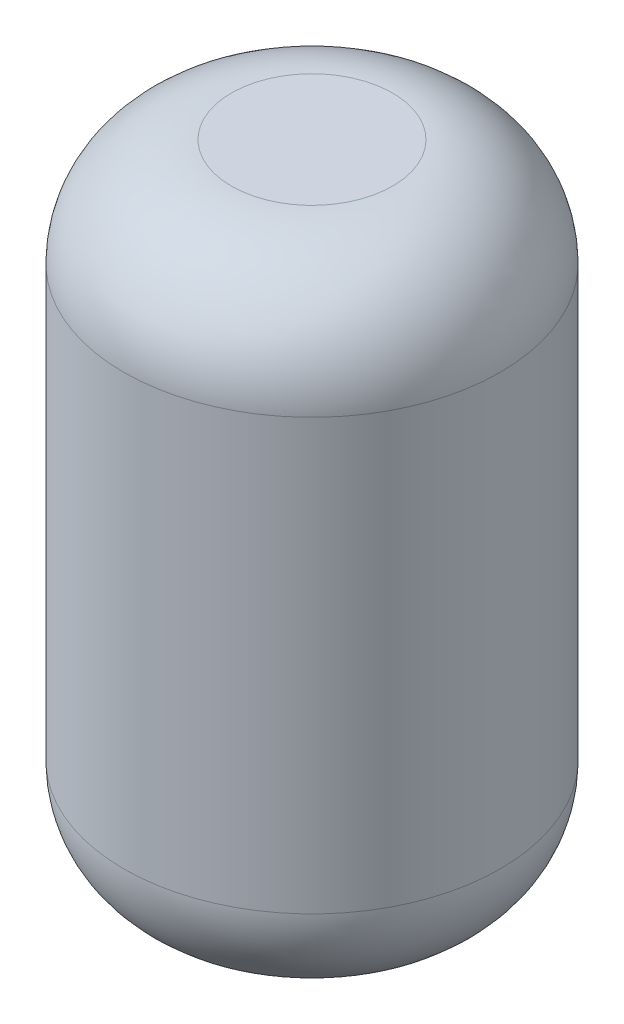
ISO-10303-21;
HEADER;
FILE_DESCRIPTION(('STEP AP214'),'2;1');
FILE_NAME('part.step','',(''),(''),'','','');
FILE_SCHEMA(('AUTOMOTIVE_DESIGN { 1 0 10303 214 1 1 1 1 }'));
ENDSEC;
DATA;
#1=APPLICATION_CONTEXT('core data for automotive mechanical design processes');
#2=APPLICATION_PROTOCOL_DEFINITION('international standard','automotive_design',2000,#1);
#3=PRODUCT_CONTEXT('',#1,'mechanical');
#4=PRODUCT('Part','Part','',(#3));
#5=PRODUCT_RELATED_PRODUCT_CATEGORY('part','',(#4));
#6=PRODUCT_DEFINITION_FORMATION('','',#4);
#7=PRODUCT_DEFINITION_CONTEXT('part definition',#1,'design');
#8=PRODUCT_DEFINITION('design','',#6,#7);
#9=PRODUCT_DEFINITION_SHAPE('','',#8);
#10=(LENGTH_UNIT() NAMED_UNIT(*) SI_UNIT(.MILLI.,.METRE.));
#11=(NAMED_UNIT(*) PLANE_ANGLE_UNIT() SI_UNIT($,.RADIAN.));
#12=(NAMED_UNIT(*) SI_UNIT($,.STERADIAN.) SOLID_ANGLE_UNIT());
#13=UNCERTAINTY_MEASURE_WITH_UNIT(LENGTH_MEASURE(1.E-05),#10,'distance_accuracy_value','');
#14=(GEOMETRIC_REPRESENTATION_CONTEXT(3) GLOBAL_UNCERTAINTY_ASSIGNED_CONTEXT((#13)) GLOBAL_UNIT_ASSIGNED_CONTEXT((#10,
#11,#12)) REPRESENTATION_CONTEXT('',''));
#15=CARTESIAN_POINT('',(0.,0.,0.));
#16=DIRECTION('',(0.,0.,1.));
#17=DIRECTION('',(1.,0.,0.));
#18=AXIS2_PLACEMENT_3D('',#15,#16,#17);
#19=CARTESIAN_POINT('',(0.,152.4,0.));
#20=DIRECTION('',(0.,-1.,0.));
#21=DIRECTION('',(0.,0.,-1.));
#22=AXIS2_PLACEMENT_3D('',#19,#20,#21);
#23=CYLINDRICAL_SURFACE('',#22,44.45);
#24=CARTESIAN_POINT('',(0.,25.3999999999999,0.));
#25=DIRECTION('',(0.,1.,0.));
#26=DIRECTION('',(0.,0.,1.));
#27=AXIS2_PLACEMENT_3D('',#24,#25,#26);
#28=CIRCLE('',#27,44.45);
#29=CARTESIAN_POINT('',(0.,25.3999999999999,-44.45));
#30=VERTEX_POINT('',#29);
#31=EDGE_CURVE('E52',#30,#30,#28,.T.);
#32=CARTESIAN_POINT('',(0.,127.,0.));
#33=DIRECTION('',(0.,1.,0.));
#34=DIRECTION('',(0.,0.,1.));
#35=AXIS2_PLACEMENT_3D('',#32,#33,#34);
#36=CIRCLE('',#35,44.45);
#37=CARTESIAN_POINT('',(0.,127.,-44.45));
#38=VERTEX_POINT('',#37);
#39=EDGE_CURVE('E57',#38,#38,#36,.F.);
#40=CARTESIAN_POINT('',(0.,25.3999999999999,-44.45));
#41=CARTESIAN_POINT('',(0.,26.4583333333333,-44.45));
#42=CARTESIAN_POINT('',(0.,27.5166666666666,-44.45));
#43=CARTESIAN_POINT('',(0.,29.6333333333332,-44.45));
#44=CARTESIAN_POINT('',(0.,30.6916666666666,-44.45));
#45=CARTESIAN_POINT('',(0.,32.8083333333333,-44.45));
#46=CARTESIAN_POINT('',(0.,33.8666666666666,-44.45));
#47=CARTESIAN_POINT('',(0.,35.9833333333332,-44.45));
#48=CARTESIAN_POINT('',(0.,37.0416666666666,-44.45));
#49=CARTESIAN_POINT('',(0.,39.1583333333333,-44.45));
#50=CARTESIAN_POINT('',(0.,40.2166666666666,-44.45));
#51=CARTESIAN_POINT('',(0.,42.3333333333333,-44.45));
#52=CARTESIAN_POINT('',(0.,43.3916666666666,-44.45));
#53=CARTESIAN_POINT('',(0.,45.5083333333333,-44.45));
#54=CARTESIAN_POINT('',(0.,46.5666666666666,-44.45));
#55=CARTESIAN_POINT('',(0.,48.6833333333333,-44.45));
#56=CARTESIAN_POINT('',(0.,49.7416666666666,-44.45));
#57=CARTESIAN_POINT('',(0.,51.8583333333333,-44.45));
#58=CARTESIAN_POINT('',(0.,52.9166666666666,-44.45));
#59=CARTESIAN_POINT('',(0.,55.0333333333333,-44.45));
#60=CARTESIAN_POINT('',(0.,56.0916666666666,-44.45));
#61=CARTESIAN_POINT('',(0.,58.2083333333333,-44.45));
#62=CARTESIAN_POINT('',(0.,59.2666666666666,-44.45));
#63=CARTESIAN_POINT('',(0.,61.3833333333333,-44.45));
#64=CARTESIAN_POINT('',(0.,62.4416666666666,-44.45));
#65=CARTESIAN_POINT('',(0.,64.5583333333333,-44.45));
#66=CARTESIAN_POINT('',(0.,65.6166666666666,-44.45));
#67=CARTESIAN_POINT('',(0.,67.7333333333333,-44.45));
#68=CARTESIAN_POINT('',(0.,68.7916666666666,-44.45));
#69=CARTESIAN_POINT('',(0.,70.9083333333333,-44.45));
#70=CARTESIAN_POINT('',(0.,71.9666666666666,-44.45));
#71=CARTESIAN_POINT('',(0.,74.0833333333333,-44.45));
#72=CARTESIAN_POINT('',(0.,75.1416666666666,-44.45));
#73=CARTESIAN_POINT('',(0.,77.2583333333333,-44.45));
#74=CARTESIAN_POINT('',(0.,78.3166666666666,-44.45));
#75=CARTESIAN_POINT('',(0.,80.4333333333333,-44.45));
#76=CARTESIAN_POINT('',(0.,81.4916666666666,-44.45));
#77=CARTESIAN_POINT('',(0.,83.6083333333333,-44.45));
#78=CARTESIAN_POINT('',(0.,84.6666666666666,-44.45));
#79=CARTESIAN_POINT('',(0.,86.7833333333333,-44.45));
#80=CARTESIAN_POINT('',(0.,87.8416666666666,-44.45));
#81=CARTESIAN_POINT('',(0.,89.9583333333333,-44.45));
#82=CARTESIAN_POINT('',(0.,91.0166666666666,-44.45));
#83=CARTESIAN_POINT('',(0.,93.1333333333333,-44.45));
#84=CARTESIAN_POINT('',(0.,94.1916666666666,-44.45));
#85=CARTESIAN_POINT('',(0.,96.3083333333333,-44.45));
#86=CARTESIAN_POINT('',(0.,97.3666666666666,-44.45));
#87=CARTESIAN_POINT('',(0.,99.4833333333333,-44.45));
#88=CARTESIAN_POINT('',(0.,100.541666666667,-44.45));
#89=CARTESIAN_POINT('',(0.,102.658333333333,-44.45));
#90=CARTESIAN_POINT('',(0.,103.716666666667,-44.45));
#91=CARTESIAN_POINT('',(0.,105.833333333333,-44.45));
#92=CARTESIAN_POINT('',(0.,106.891666666667,-44.45));
#93=CARTESIAN_POINT('',(0.,109.008333333333,-44.45));
#94=CARTESIAN_POINT('',(0.,110.066666666667,-44.45));
#95=CARTESIAN_POINT('',(0.,112.183333333333,-44.45));
#96=CARTESIAN_POINT('',(0.,113.241666666667,-44.45));
#97=CARTESIAN_POINT('',(0.,115.358333333333,-44.45));
#98=CARTESIAN_POINT('',(0.,116.416666666667,-44.45));
#99=CARTESIAN_POINT('',(0.,118.533333333333,-44.45));
#100=CARTESIAN_POINT('',(0.,119.591666666667,-44.45));
#101=CARTESIAN_POINT('',(0.,121.708333333333,-44.45));
#102=CARTESIAN_POINT('',(0.,122.766666666667,-44.45));
#103=CARTESIAN_POINT('',(0.,124.883333333333,-44.45));
#104=CARTESIAN_POINT('',(0.,125.941666666667,-44.45));
#105=CARTESIAN_POINT('',(0.,127.,-44.45));
#106=B_SPLINE_CURVE_WITH_KNOTS('',3,(#40,#41,#42,#43,#44,#45,#46,#47,#48,#49,#50,#51,#52,#53,
#54,#55,#56,#57,#58,#59,#60,#61,#62,#63,#64,#65,#66,#67,#68,#69,#70,#71,#72,#73,#74,#75,#76,#77,
#78,#79,#80,#81,#82,#83,#84,#85,#86,#87,#88,#89,#90,#91,#92,#93,#94,#95,#96,#97,#98,#99,#100,
#101,#102,#103,#104,#105),.UNSPECIFIED.,.F.,.F.,(4,2,2,2,2,2,2,2,2,2,2,2,2,2,2,2,2,2,2,2,2,2,2,
2,2,2,2,2,2,2,2,2,4),(0.,3.17499999999998,6.34999999999999,9.52499999999999,12.7,15.875,19.05,
22.225,25.4,28.575,31.75,34.925,38.1,41.275,44.45,47.625,50.8,53.975,57.15,60.325,63.5,66.675,
69.85,73.025,76.2,79.375,82.55,85.7250000000001,88.9,92.075,95.2500000000001,98.4250000000001,
101.6),.UNSPECIFIED.);
#107=EDGE_CURVE('BSEAM39',#30,#38,#106,.T.);
#108=ORIENTED_EDGE('',*,*,#31,.T.);
#109=ORIENTED_EDGE('',*,*,#39,.T.);
#110=ORIENTED_EDGE('',*,*,#107,.T.);
#111=ORIENTED_EDGE('',*,*,#107,.F.);
#112=EDGE_LOOP('',(#108,#110,#109,#111));
#113=FACE_BOUND('',#112,.T.);
#114=ADVANCED_FACE('F39',(#113),#23,.T.);
#115=CARTESIAN_POINT('',(0.,152.4,0.));
#116=DIRECTION('',(0.,1.,0.));
#117=DIRECTION('',(0.,0.,1.));
#118=AXIS2_PLACEMENT_3D('',#115,#116,#117);
#119=PLANE('',#118);
#120=CARTESIAN_POINT('',(0.,152.4,0.));
#121=DIRECTION('',(0.,1.,0.));
#122=DIRECTION('',(0.,0.,1.));
#123=AXIS2_PLACEMENT_3D('',#120,#121,#122);
#124=CIRCLE('',#123,19.05);
#125=CARTESIAN_POINT('',(0.,152.4,19.05));
#126=VERTEX_POINT('',#125);
#127=EDGE_CURVE('E10',#126,#126,#124,.T.);
#128=ORIENTED_EDGE('',*,*,#127,.T.);
#129=EDGE_LOOP('',(#128));
#130=FACE_BOUND('',#129,.T.);
#131=ADVANCED_FACE('F74',(#130),#119,.T.);
#132=CARTESIAN_POINT('',(0.,0.,0.));
#133=DIRECTION('',(0.,1.,0.));
#134=DIRECTION('',(0.,0.,1.));
#135=AXIS2_PLACEMENT_3D('',#132,#133,#134);
#136=PLANE('',#135);
#137=CARTESIAN_POINT('',(0.,0.,0.));
#138=DIRECTION('',(0.,1.,0.));
#139=DIRECTION('',(0.,0.,1.));
#140=AXIS2_PLACEMENT_3D('',#137,#138,#139);
#141=CIRCLE('',#140,19.05);
#142=CARTESIAN_POINT('',(0.,0.,19.05));
#143=VERTEX_POINT('',#142);
#144=EDGE_CURVE('E47',#143,#143,#141,.F.);
#145=ORIENTED_EDGE('',*,*,#144,.T.);
#146=EDGE_LOOP('',(#145));
#147=FACE_BOUND('',#146,.T.);
#148=ADVANCED_FACE('F71',(#147),#136,.F.);
#149=CARTESIAN_POINT('',(0.,25.4,0.));
#150=DIRECTION('',(0.,1.,0.));
#151=DIRECTION('',(0.,0.,1.));
#152=AXIS2_PLACEMENT_3D('',#149,#150,#151);
#153=DEGENERATE_TOROIDAL_SURFACE('',#152,19.05,25.4,.T.);
#154=ORIENTED_EDGE('',*,*,#144,.F.);
#155=EDGE_LOOP('',(#154));
#156=FACE_BOUND('',#155,.T.);
#157=ORIENTED_EDGE('',*,*,#31,.F.);
#158=EDGE_LOOP('',(#157));
#159=FACE_BOUND('',#158,.T.);
#160=ADVANCED_FACE('F67',(#156,#159),#153,.T.);
#161=CARTESIAN_POINT('',(0.,127.,0.));
#162=DIRECTION('',(0.,1.,0.));
#163=DIRECTION('',(0.,0.,1.));
#164=AXIS2_PLACEMENT_3D('',#161,#162,#163);
#165=DEGENERATE_TOROIDAL_SURFACE('',#164,19.05,25.4,.T.);
#166=ORIENTED_EDGE('',*,*,#39,.F.);
#167=EDGE_LOOP('',(#166));
#168=FACE_BOUND('',#167,.T.);
#169=ORIENTED_EDGE('',*,*,#127,.F.);
#170=EDGE_LOOP('',(#169));
#171=FACE_BOUND('',#170,.T.);
#172=ADVANCED_FACE('F41',(#168,#171),#165,.T.);
#173=CLOSED_SHELL('',(#114,#131,#148,#160,#172));
#174=MANIFOLD_SOLID_BREP('B2',#173);
#175=ADVANCED_BREP_SHAPE_REPRESENTATION('',(#18,#174),#14);
#176=SHAPE_DEFINITION_REPRESENTATION(#9,#175);
ENDSEC;
END-ISO-10303-21;
